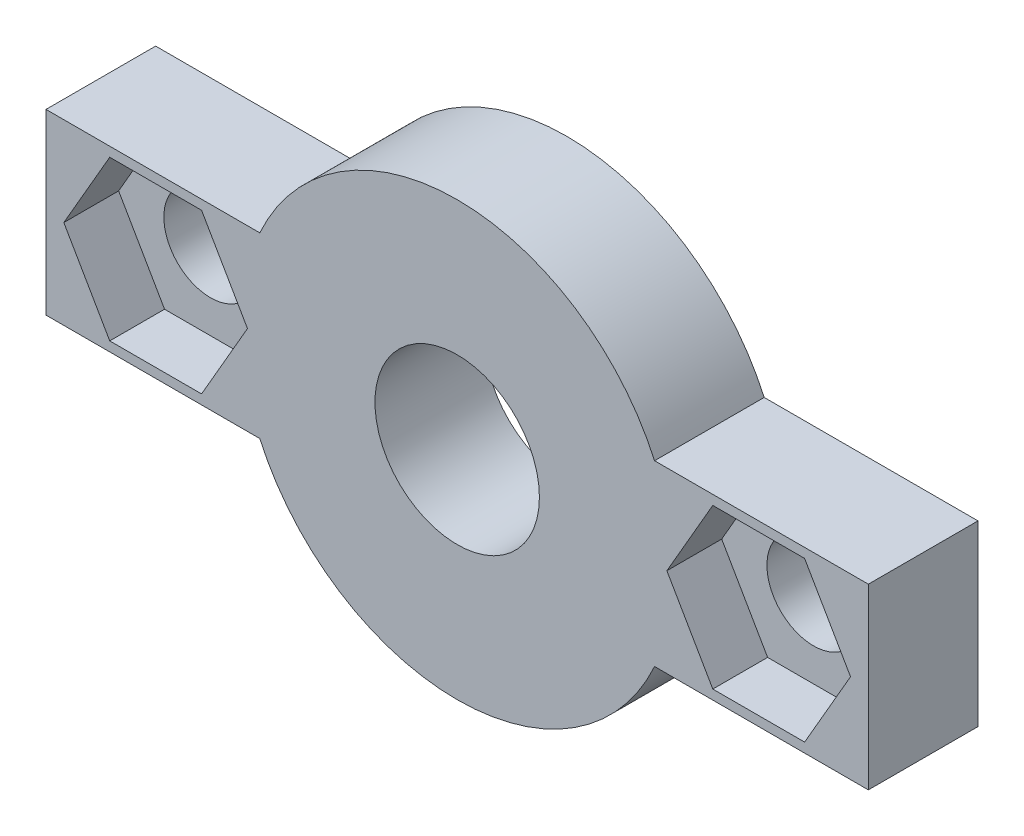
ISO-10303-21;
HEADER;
FILE_DESCRIPTION(('STEP AP214'),'2;1');
FILE_NAME('part.step','',(''),(''),'','','');
FILE_SCHEMA(('AUTOMOTIVE_DESIGN { 1 0 10303 214 1 1 1 1 }'));
ENDSEC;
DATA;
#1=APPLICATION_CONTEXT('core data for automotive mechanical design processes');
#2=APPLICATION_PROTOCOL_DEFINITION('international standard','automotive_design',2000,#1);
#3=PRODUCT_CONTEXT('',#1,'mechanical');
#4=PRODUCT('Part','Part','',(#3));
#5=PRODUCT_RELATED_PRODUCT_CATEGORY('part','',(#4));
#6=PRODUCT_DEFINITION_FORMATION('','',#4);
#7=PRODUCT_DEFINITION_CONTEXT('part definition',#1,'design');
#8=PRODUCT_DEFINITION('design','',#6,#7);
#9=PRODUCT_DEFINITION_SHAPE('','',#8);
#10=(LENGTH_UNIT() NAMED_UNIT(*) SI_UNIT(.MILLI.,.METRE.));
#11=(NAMED_UNIT(*) PLANE_ANGLE_UNIT() SI_UNIT($,.RADIAN.));
#12=(NAMED_UNIT(*) SI_UNIT($,.STERADIAN.) SOLID_ANGLE_UNIT());
#13=UNCERTAINTY_MEASURE_WITH_UNIT(LENGTH_MEASURE(1.E-05),#10,'distance_accuracy_value','');
#14=(GEOMETRIC_REPRESENTATION_CONTEXT(3) GLOBAL_UNCERTAINTY_ASSIGNED_CONTEXT((#13)) GLOBAL_UNIT_ASSIGNED_CONTEXT((#10,
#11,#12)) REPRESENTATION_CONTEXT('',''));
#15=CARTESIAN_POINT('',(0.,0.,0.));
#16=DIRECTION('',(0.,0.,1.));
#17=DIRECTION('',(1.,0.,0.));
#18=AXIS2_PLACEMENT_3D('',#15,#16,#17);
#19=CARTESIAN_POINT('',(0.,0.,4.));
#20=DIRECTION('',(0.,0.,1.));
#21=DIRECTION('',(1.,0.,0.));
#22=AXIS2_PLACEMENT_3D('',#19,#20,#21);
#23=PLANE('',#22);
#24=DIRECTION('',(-0.5,-0.866025403784439,0.));
#25=VECTOR('',#24,1.);
#26=CARTESIAN_POINT('',(-12.675,2.90118510267787,4.));
#27=LINE('',#26,#25);
#28=CARTESIAN_POINT('',(-12.675,2.90118510267787,4.));
#29=VERTEX_POINT('',#28);
#30=CARTESIAN_POINT('',(-14.35,0.,4.));
#31=VERTEX_POINT('',#30);
#32=EDGE_CURVE('E58',#29,#31,#27,.T.);
#33=ORIENTED_EDGE('',*,*,#32,.F.);
#34=DIRECTION('',(-1.,0.,0.));
#35=VECTOR('',#34,1.);
#36=CARTESIAN_POINT('',(-9.325,2.90118510267787,4.));
#37=LINE('',#36,#35);
#38=CARTESIAN_POINT('',(-9.325,2.90118510267787,4.));
#39=VERTEX_POINT('',#38);
#40=EDGE_CURVE('E204',#39,#29,#37,.T.);
#41=ORIENTED_EDGE('',*,*,#40,.F.);
#42=DIRECTION('',(-0.5,0.866025403784439,0.));
#43=VECTOR('',#42,1.);
#44=CARTESIAN_POINT('',(-7.65,0.,4.));
#45=LINE('',#44,#43);
#46=CARTESIAN_POINT('',(-7.65,0.,4.));
#47=VERTEX_POINT('',#46);
#48=EDGE_CURVE('E209',#47,#39,#45,.T.);
#49=ORIENTED_EDGE('',*,*,#48,.F.);
#50=DIRECTION('',(0.5,0.866025403784439,0.));
#51=VECTOR('',#50,1.);
#52=CARTESIAN_POINT('',(-9.325,-2.90118510267787,4.));
#53=LINE('',#52,#51);
#54=CARTESIAN_POINT('',(-9.325,-2.90118510267787,4.));
#55=VERTEX_POINT('',#54);
#56=EDGE_CURVE('E236',#55,#47,#53,.T.);
#57=ORIENTED_EDGE('',*,*,#56,.F.);
#58=DIRECTION('',(1.,0.,0.));
#59=VECTOR('',#58,1.);
#60=CARTESIAN_POINT('',(-12.675,-2.90118510267787,4.));
#61=LINE('',#60,#59);
#62=CARTESIAN_POINT('',(-12.675,-2.90118510267787,4.));
#63=VERTEX_POINT('',#62);
#64=EDGE_CURVE('E232',#63,#55,#61,.T.);
#65=ORIENTED_EDGE('',*,*,#64,.F.);
#66=DIRECTION('',(0.5,-0.866025403784438,0.));
#67=VECTOR('',#66,1.);
#68=CARTESIAN_POINT('',(-14.35,0.,4.));
#69=LINE('',#68,#67);
#70=EDGE_CURVE('E228',#31,#63,#69,.T.);
#71=ORIENTED_EDGE('',*,*,#70,.F.);
#72=EDGE_LOOP('',(#33,#41,#49,#57,#65,#71));
#73=FACE_BOUND('',#72,.T.);
#74=DIRECTION('',(0.5,0.866025403784439,0.));
#75=VECTOR('',#74,1.);
#76=CARTESIAN_POINT('',(12.675,-2.90118510267787,4.));
#77=LINE('',#76,#75);
#78=CARTESIAN_POINT('',(12.675,-2.90118510267787,4.));
#79=VERTEX_POINT('',#78);
#80=CARTESIAN_POINT('',(14.35,0.,4.));
#81=VERTEX_POINT('',#80);
#82=EDGE_CURVE('E66',#79,#81,#77,.T.);
#83=ORIENTED_EDGE('',*,*,#82,.F.);
#84=DIRECTION('',(1.,0.,0.));
#85=VECTOR('',#84,1.);
#86=CARTESIAN_POINT('',(9.325,-2.90118510267787,4.));
#87=LINE('',#86,#85);
#88=CARTESIAN_POINT('',(9.325,-2.90118510267787,4.));
#89=VERTEX_POINT('',#88);
#90=EDGE_CURVE('E263',#89,#79,#87,.T.);
#91=ORIENTED_EDGE('',*,*,#90,.F.);
#92=DIRECTION('',(0.5,-0.866025403784439,0.));
#93=VECTOR('',#92,1.);
#94=CARTESIAN_POINT('',(7.65,0.,4.));
#95=LINE('',#94,#93);
#96=CARTESIAN_POINT('',(7.65,0.,4.));
#97=VERTEX_POINT('',#96);
#98=EDGE_CURVE('E298',#97,#89,#95,.T.);
#99=ORIENTED_EDGE('',*,*,#98,.F.);
#100=DIRECTION('',(-0.5,-0.866025403784439,0.));
#101=VECTOR('',#100,1.);
#102=CARTESIAN_POINT('',(9.325,2.90118510267787,4.));
#103=LINE('',#102,#101);
#104=CARTESIAN_POINT('',(9.325,2.90118510267787,4.));
#105=VERTEX_POINT('',#104);
#106=EDGE_CURVE('E294',#105,#97,#103,.T.);
#107=ORIENTED_EDGE('',*,*,#106,.F.);
#108=DIRECTION('',(-1.,0.,0.));
#109=VECTOR('',#108,1.);
#110=CARTESIAN_POINT('',(12.675,2.90118510267787,4.));
#111=LINE('',#110,#109);
#112=CARTESIAN_POINT('',(12.675,2.90118510267787,4.));
#113=VERTEX_POINT('',#112);
#114=EDGE_CURVE('E290',#113,#105,#111,.T.);
#115=ORIENTED_EDGE('',*,*,#114,.F.);
#116=DIRECTION('',(-0.5,0.866025403784439,0.));
#117=VECTOR('',#116,1.);
#118=CARTESIAN_POINT('',(14.35,0.,4.));
#119=LINE('',#118,#117);
#120=EDGE_CURVE('E286',#81,#113,#119,.T.);
#121=ORIENTED_EDGE('',*,*,#120,.F.);
#122=EDGE_LOOP('',(#83,#91,#99,#107,#115,#121));
#123=FACE_BOUND('',#122,.T.);
#124=DIRECTION('',(0.,-1.,0.));
#125=VECTOR('',#124,1.);
#126=CARTESIAN_POINT('',(-15.,-3.25,4.));
#127=LINE('',#126,#125);
#128=CARTESIAN_POINT('',(-15.,3.25,4.));
#129=VERTEX_POINT('',#128);
#130=CARTESIAN_POINT('',(-15.,-3.25,4.));
#131=VERTEX_POINT('',#130);
#132=EDGE_CURVE('E329',#129,#131,#127,.T.);
#133=ORIENTED_EDGE('',*,*,#132,.T.);
#134=DIRECTION('',(1.,0.,0.));
#135=VECTOR('',#134,1.);
#136=CARTESIAN_POINT('',(-7.20052081449669,-3.25,4.));
#137=LINE('',#136,#135);
#138=CARTESIAN_POINT('',(-7.20052081449669,-3.25,4.));
#139=VERTEX_POINT('',#138);
#140=EDGE_CURVE('E333',#131,#139,#137,.T.);
#141=ORIENTED_EDGE('',*,*,#140,.T.);
#142=CARTESIAN_POINT('',(0.,0.,4.));
#143=DIRECTION('',(0.,0.,1.));
#144=DIRECTION('',(1.,0.,0.));
#145=AXIS2_PLACEMENT_3D('',#142,#143,#144);
#146=CIRCLE('',#145,7.9);
#147=CARTESIAN_POINT('',(7.20052081449669,-3.25,4.));
#148=VERTEX_POINT('',#147);
#149=EDGE_CURVE('E337',#139,#148,#146,.T.);
#150=ORIENTED_EDGE('',*,*,#149,.T.);
#151=DIRECTION('',(1.,0.,0.));
#152=VECTOR('',#151,1.);
#153=CARTESIAN_POINT('',(15.,-3.25,4.));
#154=LINE('',#153,#152);
#155=CARTESIAN_POINT('',(15.,-3.25,4.));
#156=VERTEX_POINT('',#155);
#157=EDGE_CURVE('E340',#148,#156,#154,.T.);
#158=ORIENTED_EDGE('',*,*,#157,.T.);
#159=DIRECTION('',(0.,1.,0.));
#160=VECTOR('',#159,1.);
#161=CARTESIAN_POINT('',(15.,-3.25,4.));
#162=LINE('',#161,#160);
#163=CARTESIAN_POINT('',(15.,3.25,4.));
#164=VERTEX_POINT('',#163);
#165=EDGE_CURVE('E343',#156,#164,#162,.T.);
#166=ORIENTED_EDGE('',*,*,#165,.T.);
#167=DIRECTION('',(-1.,0.,0.));
#168=VECTOR('',#167,1.);
#169=CARTESIAN_POINT('',(15.,3.25,4.));
#170=LINE('',#169,#168);
#171=CARTESIAN_POINT('',(7.20052081449669,3.25,4.));
#172=VERTEX_POINT('',#171);
#173=EDGE_CURVE('E346',#164,#172,#170,.T.);
#174=ORIENTED_EDGE('',*,*,#173,.T.);
#175=CARTESIAN_POINT('',(0.,0.,4.));
#176=DIRECTION('',(0.,0.,1.));
#177=DIRECTION('',(1.,0.,0.));
#178=AXIS2_PLACEMENT_3D('',#175,#176,#177);
#179=CIRCLE('',#178,7.9);
#180=CARTESIAN_POINT('',(-7.20052081449669,3.25,4.));
#181=VERTEX_POINT('',#180);
#182=EDGE_CURVE('E349',#172,#181,#179,.T.);
#183=ORIENTED_EDGE('',*,*,#182,.T.);
#184=DIRECTION('',(-1.,0.,0.));
#185=VECTOR('',#184,1.);
#186=CARTESIAN_POINT('',(-7.20052081449669,3.25,4.));
#187=LINE('',#186,#185);
#188=EDGE_CURVE('E352',#181,#129,#187,.T.);
#189=ORIENTED_EDGE('',*,*,#188,.T.);
#190=EDGE_LOOP('',(#133,#141,#150,#158,#166,#174,#183,#189));
#191=FACE_BOUND('',#190,.T.);
#192=CARTESIAN_POINT('',(0.,0.,4.));
#193=DIRECTION('',(0.,0.,1.));
#194=DIRECTION('',(1.,0.,0.));
#195=AXIS2_PLACEMENT_3D('',#192,#193,#194);
#196=CIRCLE('',#195,3.);
#197=CARTESIAN_POINT('',(3.,0.,4.));
#198=VERTEX_POINT('',#197);
#199=EDGE_CURVE('E321',#198,#198,#196,.T.);
#200=ORIENTED_EDGE('',*,*,#199,.F.);
#201=EDGE_LOOP('',(#200));
#202=FACE_BOUND('',#201,.T.);
#203=ADVANCED_FACE('F40',(#73,#123,#191,#202),#23,.T.);
#204=CARTESIAN_POINT('',(0.,0.,0.));
#205=DIRECTION('',(0.,0.,1.));
#206=DIRECTION('',(1.,0.,0.));
#207=AXIS2_PLACEMENT_3D('',#204,#205,#206);
#208=PLANE('',#207);
#209=CARTESIAN_POINT('',(-11.,0.,0.));
#210=DIRECTION('',(0.,0.,1.));
#211=DIRECTION('',(1.,0.,0.));
#212=AXIS2_PLACEMENT_3D('',#209,#210,#211);
#213=CIRCLE('',#212,1.7);
#214=CARTESIAN_POINT('',(-9.3,0.,0.));
#215=VERTEX_POINT('',#214);
#216=EDGE_CURVE('E407',#215,#215,#213,.T.);
#217=ORIENTED_EDGE('',*,*,#216,.T.);
#218=EDGE_LOOP('',(#217));
#219=FACE_BOUND('',#218,.T.);
#220=CARTESIAN_POINT('',(11.,0.,0.));
#221=DIRECTION('',(0.,0.,1.));
#222=DIRECTION('',(1.,0.,0.));
#223=AXIS2_PLACEMENT_3D('',#220,#221,#222);
#224=CIRCLE('',#223,1.7);
#225=CARTESIAN_POINT('',(12.7,0.,0.));
#226=VERTEX_POINT('',#225);
#227=EDGE_CURVE('E212',#226,#226,#224,.T.);
#228=ORIENTED_EDGE('',*,*,#227,.T.);
#229=EDGE_LOOP('',(#228));
#230=FACE_BOUND('',#229,.T.);
#231=DIRECTION('',(0.,-1.,0.));
#232=VECTOR('',#231,1.);
#233=CARTESIAN_POINT('',(-15.,-3.25,0.));
#234=LINE('',#233,#232);
#235=CARTESIAN_POINT('',(-15.,3.25,0.));
#236=VERTEX_POINT('',#235);
#237=CARTESIAN_POINT('',(-15.,-3.25,0.));
#238=VERTEX_POINT('',#237);
#239=EDGE_CURVE('E325',#236,#238,#234,.T.);
#240=ORIENTED_EDGE('',*,*,#239,.F.);
#241=DIRECTION('',(-1.,0.,0.));
#242=VECTOR('',#241,1.);
#243=CARTESIAN_POINT('',(-7.20052081449669,3.25,0.));
#244=LINE('',#243,#242);
#245=CARTESIAN_POINT('',(-7.20052081449669,3.25,0.));
#246=VERTEX_POINT('',#245);
#247=EDGE_CURVE('E334',#246,#236,#244,.T.);
#248=ORIENTED_EDGE('',*,*,#247,.F.);
#249=CARTESIAN_POINT('',(0.,0.,0.));
#250=DIRECTION('',(0.,0.,1.));
#251=DIRECTION('',(1.,0.,0.));
#252=AXIS2_PLACEMENT_3D('',#249,#250,#251);
#253=CIRCLE('',#252,7.9);
#254=CARTESIAN_POINT('',(7.20052081449669,3.25,0.));
#255=VERTEX_POINT('',#254);
#256=EDGE_CURVE('E374',#255,#246,#253,.T.);
#257=ORIENTED_EDGE('',*,*,#256,.F.);
#258=DIRECTION('',(-1.,0.,0.));
#259=VECTOR('',#258,1.);
#260=CARTESIAN_POINT('',(15.,3.25,0.));
#261=LINE('',#260,#259);
#262=CARTESIAN_POINT('',(15.,3.25,0.));
#263=VERTEX_POINT('',#262);
#264=EDGE_CURVE('E371',#263,#255,#261,.T.);
#265=ORIENTED_EDGE('',*,*,#264,.F.);
#266=DIRECTION('',(0.,1.,0.));
#267=VECTOR('',#266,1.);
#268=CARTESIAN_POINT('',(15.,-3.25,0.));
#269=LINE('',#268,#267);
#270=CARTESIAN_POINT('',(15.,-3.25,0.));
#271=VERTEX_POINT('',#270);
#272=EDGE_CURVE('E368',#271,#263,#269,.T.);
#273=ORIENTED_EDGE('',*,*,#272,.F.);
#274=DIRECTION('',(1.,0.,0.));
#275=VECTOR('',#274,1.);
#276=CARTESIAN_POINT('',(15.,-3.25,0.));
#277=LINE('',#276,#275);
#278=CARTESIAN_POINT('',(7.20052081449669,-3.25,0.));
#279=VERTEX_POINT('',#278);
#280=EDGE_CURVE('E365',#279,#271,#277,.T.);
#281=ORIENTED_EDGE('',*,*,#280,.F.);
#282=CARTESIAN_POINT('',(0.,0.,0.));
#283=DIRECTION('',(0.,0.,1.));
#284=DIRECTION('',(1.,0.,0.));
#285=AXIS2_PLACEMENT_3D('',#282,#283,#284);
#286=CIRCLE('',#285,7.9);
#287=CARTESIAN_POINT('',(-7.20052081449669,-3.25,0.));
#288=VERTEX_POINT('',#287);
#289=EDGE_CURVE('E362',#288,#279,#286,.T.);
#290=ORIENTED_EDGE('',*,*,#289,.F.);
#291=DIRECTION('',(1.,0.,0.));
#292=VECTOR('',#291,1.);
#293=CARTESIAN_POINT('',(-7.20052081449669,-3.25,0.));
#294=LINE('',#293,#292);
#295=EDGE_CURVE('E359',#238,#288,#294,.T.);
#296=ORIENTED_EDGE('',*,*,#295,.F.);
#297=EDGE_LOOP('',(#240,#248,#257,#265,#273,#281,#290,#296));
#298=FACE_BOUND('',#297,.T.);
#299=CARTESIAN_POINT('',(0.,0.,0.));
#300=DIRECTION('',(0.,0.,1.));
#301=DIRECTION('',(1.,0.,0.));
#302=AXIS2_PLACEMENT_3D('',#299,#300,#301);
#303=CIRCLE('',#302,3.);
#304=CARTESIAN_POINT('',(3.,0.,0.));
#305=VERTEX_POINT('',#304);
#306=EDGE_CURVE('E246',#305,#305,#303,.T.);
#307=ORIENTED_EDGE('',*,*,#306,.T.);
#308=EDGE_LOOP('',(#307));
#309=FACE_BOUND('',#308,.T.);
#310=ADVANCED_FACE('F426',(#219,#230,#298,#309),#208,.F.);
#311=CARTESIAN_POINT('',(-15.,-3.25,4.));
#312=DIRECTION('',(1.,0.,0.));
#313=DIRECTION('',(0.,0.,-1.));
#314=AXIS2_PLACEMENT_3D('',#311,#312,#313);
#315=PLANE('',#314);
#316=ORIENTED_EDGE('',*,*,#239,.T.);
#317=DIRECTION('',(0.,0.,-1.));
#318=VECTOR('',#317,1.);
#319=CARTESIAN_POINT('',(-15.,-3.25,4.));
#320=LINE('',#319,#318);
#321=EDGE_CURVE('E11',#131,#238,#320,.T.);
#322=ORIENTED_EDGE('',*,*,#321,.F.);
#323=ORIENTED_EDGE('',*,*,#132,.F.);
#324=DIRECTION('',(0.,0.,-1.));
#325=VECTOR('',#324,1.);
#326=CARTESIAN_POINT('',(-15.,3.25,4.));
#327=LINE('',#326,#325);
#328=EDGE_CURVE('E355',#129,#236,#327,.T.);
#329=ORIENTED_EDGE('',*,*,#328,.T.);
#330=EDGE_LOOP('',(#316,#322,#323,#329));
#331=FACE_BOUND('',#330,.T.);
#332=ADVANCED_FACE('F42',(#331),#315,.F.);
#333=CARTESIAN_POINT('',(-7.20052081449669,-3.25,4.));
#334=DIRECTION('',(0.,1.,0.));
#335=DIRECTION('',(-1.,0.,0.));
#336=AXIS2_PLACEMENT_3D('',#333,#334,#335);
#337=PLANE('',#336);
#338=ORIENTED_EDGE('',*,*,#295,.T.);
#339=DIRECTION('',(0.,0.,-1.));
#340=VECTOR('',#339,1.);
#341=CARTESIAN_POINT('',(-7.20052081449669,-3.25,4.));
#342=LINE('',#341,#340);
#343=EDGE_CURVE('E50',#139,#288,#342,.T.);
#344=ORIENTED_EDGE('',*,*,#343,.F.);
#345=ORIENTED_EDGE('',*,*,#140,.F.);
#346=ORIENTED_EDGE('',*,*,#321,.T.);
#347=EDGE_LOOP('',(#338,#344,#345,#346));
#348=FACE_BOUND('',#347,.T.);
#349=ADVANCED_FACE('F472',(#348),#337,.F.);
#350=CARTESIAN_POINT('',(0.,0.,4.));
#351=DIRECTION('',(0.,0.,-1.));
#352=DIRECTION('',(-1.,0.,0.));
#353=AXIS2_PLACEMENT_3D('',#350,#351,#352);
#354=CYLINDRICAL_SURFACE('',#353,7.9);
#355=ORIENTED_EDGE('',*,*,#289,.T.);
#356=DIRECTION('',(0.,0.,-1.));
#357=VECTOR('',#356,1.);
#358=CARTESIAN_POINT('',(7.20052081449669,-3.25,4.));
#359=LINE('',#358,#357);
#360=EDGE_CURVE('E398',#148,#279,#359,.T.);
#361=ORIENTED_EDGE('',*,*,#360,.F.);
#362=ORIENTED_EDGE('',*,*,#149,.F.);
#363=ORIENTED_EDGE('',*,*,#343,.T.);
#364=EDGE_LOOP('',(#355,#361,#362,#363));
#365=FACE_BOUND('',#364,.T.);
#366=ADVANCED_FACE('F469',(#365),#354,.T.);
#367=CARTESIAN_POINT('',(15.,-3.25,4.));
#368=DIRECTION('',(0.,1.,0.));
#369=DIRECTION('',(-1.,0.,0.));
#370=AXIS2_PLACEMENT_3D('',#367,#368,#369);
#371=PLANE('',#370);
#372=ORIENTED_EDGE('',*,*,#280,.T.);
#373=DIRECTION('',(0.,0.,-1.));
#374=VECTOR('',#373,1.);
#375=CARTESIAN_POINT('',(15.,-3.25,4.));
#376=LINE('',#375,#374);
#377=EDGE_CURVE('E394',#156,#271,#376,.T.);
#378=ORIENTED_EDGE('',*,*,#377,.F.);
#379=ORIENTED_EDGE('',*,*,#157,.F.);
#380=ORIENTED_EDGE('',*,*,#360,.T.);
#381=EDGE_LOOP('',(#372,#378,#379,#380));
#382=FACE_BOUND('',#381,.T.);
#383=ADVANCED_FACE('F465',(#382),#371,.F.);
#384=CARTESIAN_POINT('',(15.,-3.25,4.));
#385=DIRECTION('',(-1.,0.,0.));
#386=DIRECTION('',(0.,-1.,0.));
#387=AXIS2_PLACEMENT_3D('',#384,#385,#386);
#388=PLANE('',#387);
#389=ORIENTED_EDGE('',*,*,#272,.T.);
#390=DIRECTION('',(0.,0.,-1.));
#391=VECTOR('',#390,1.);
#392=CARTESIAN_POINT('',(15.,3.25,4.));
#393=LINE('',#392,#391);
#394=EDGE_CURVE('E390',#164,#263,#393,.T.);
#395=ORIENTED_EDGE('',*,*,#394,.F.);
#396=ORIENTED_EDGE('',*,*,#165,.F.);
#397=ORIENTED_EDGE('',*,*,#377,.T.);
#398=EDGE_LOOP('',(#389,#395,#396,#397));
#399=FACE_BOUND('',#398,.T.);
#400=ADVANCED_FACE('F461',(#399),#388,.F.);
#401=CARTESIAN_POINT('',(15.,3.25,4.));
#402=DIRECTION('',(0.,-1.,0.));
#403=DIRECTION('',(1.,0.,0.));
#404=AXIS2_PLACEMENT_3D('',#401,#402,#403);
#405=PLANE('',#404);
#406=ORIENTED_EDGE('',*,*,#264,.T.);
#407=DIRECTION('',(0.,0.,-1.));
#408=VECTOR('',#407,1.);
#409=CARTESIAN_POINT('',(7.20052081449669,3.25,4.));
#410=LINE('',#409,#408);
#411=EDGE_CURVE('E386',#172,#255,#410,.T.);
#412=ORIENTED_EDGE('',*,*,#411,.F.);
#413=ORIENTED_EDGE('',*,*,#173,.F.);
#414=ORIENTED_EDGE('',*,*,#394,.T.);
#415=EDGE_LOOP('',(#406,#412,#413,#414));
#416=FACE_BOUND('',#415,.T.);
#417=ADVANCED_FACE('F457',(#416),#405,.F.);
#418=CARTESIAN_POINT('',(0.,0.,4.));
#419=DIRECTION('',(0.,0.,-1.));
#420=DIRECTION('',(-1.,0.,0.));
#421=AXIS2_PLACEMENT_3D('',#418,#419,#420);
#422=CYLINDRICAL_SURFACE('',#421,7.9);
#423=ORIENTED_EDGE('',*,*,#256,.T.);
#424=DIRECTION('',(0.,0.,-1.));
#425=VECTOR('',#424,1.);
#426=CARTESIAN_POINT('',(-7.20052081449669,3.25,4.));
#427=LINE('',#426,#425);
#428=EDGE_CURVE('E382',#181,#246,#427,.T.);
#429=ORIENTED_EDGE('',*,*,#428,.F.);
#430=ORIENTED_EDGE('',*,*,#182,.F.);
#431=ORIENTED_EDGE('',*,*,#411,.T.);
#432=EDGE_LOOP('',(#423,#429,#430,#431));
#433=FACE_BOUND('',#432,.T.);
#434=ADVANCED_FACE('F453',(#433),#422,.T.);
#435=CARTESIAN_POINT('',(-7.20052081449669,3.25,4.));
#436=DIRECTION('',(0.,-1.,0.));
#437=DIRECTION('',(1.,0.,0.));
#438=AXIS2_PLACEMENT_3D('',#435,#436,#437);
#439=PLANE('',#438);
#440=ORIENTED_EDGE('',*,*,#247,.T.);
#441=ORIENTED_EDGE('',*,*,#328,.F.);
#442=ORIENTED_EDGE('',*,*,#188,.F.);
#443=ORIENTED_EDGE('',*,*,#428,.T.);
#444=EDGE_LOOP('',(#440,#441,#442,#443));
#445=FACE_BOUND('',#444,.T.);
#446=ADVANCED_FACE('F450',(#445),#439,.F.);
#447=CARTESIAN_POINT('',(0.,0.,4.));
#448=DIRECTION('',(0.,0.,-1.));
#449=DIRECTION('',(-1.,0.,0.));
#450=AXIS2_PLACEMENT_3D('',#447,#448,#449);
#451=CYLINDRICAL_SURFACE('',#450,3.);
#452=ORIENTED_EDGE('',*,*,#199,.T.);
#453=EDGE_LOOP('',(#452));
#454=FACE_BOUND('',#453,.T.);
#455=ORIENTED_EDGE('',*,*,#306,.F.);
#456=EDGE_LOOP('',(#455));
#457=FACE_BOUND('',#456,.T.);
#458=ADVANCED_FACE('F447',(#454,#457),#451,.F.);
#459=CARTESIAN_POINT('',(12.675,-2.90118510267787,2.));
#460=DIRECTION('',(0.866025403784439,-0.5,0.));
#461=DIRECTION('',(0.5,0.866025403784439,0.));
#462=AXIS2_PLACEMENT_3D('',#459,#460,#461);
#463=PLANE('',#462);
#464=ORIENTED_EDGE('',*,*,#82,.T.);
#465=DIRECTION('',(0.,0.,1.));
#466=VECTOR('',#465,1.);
#467=CARTESIAN_POINT('',(14.35,0.,2.));
#468=LINE('',#467,#466);
#469=CARTESIAN_POINT('',(14.35,0.,2.));
#470=VERTEX_POINT('',#469);
#471=EDGE_CURVE('E283',#470,#81,#468,.T.);
#472=ORIENTED_EDGE('',*,*,#471,.F.);
#473=DIRECTION('',(0.5,0.866025403784439,0.));
#474=VECTOR('',#473,1.);
#475=CARTESIAN_POINT('',(12.675,-2.90118510267787,2.));
#476=LINE('',#475,#474);
#477=CARTESIAN_POINT('',(12.675,-2.90118510267787,2.));
#478=VERTEX_POINT('',#477);
#479=EDGE_CURVE('E258',#478,#470,#476,.T.);
#480=ORIENTED_EDGE('',*,*,#479,.F.);
#481=DIRECTION('',(0.,0.,1.));
#482=VECTOR('',#481,1.);
#483=CARTESIAN_POINT('',(12.675,-2.90118510267787,2.));
#484=LINE('',#483,#482);
#485=EDGE_CURVE('E229',#478,#79,#484,.T.);
#486=ORIENTED_EDGE('',*,*,#485,.T.);
#487=EDGE_LOOP('',(#464,#472,#480,#486));
#488=FACE_BOUND('',#487,.T.);
#489=ADVANCED_FACE('F509',(#488),#463,.F.);
#490=CARTESIAN_POINT('',(9.325,-2.90118510267787,2.));
#491=DIRECTION('',(0.,-1.,0.));
#492=DIRECTION('',(0.,0.,-1.));
#493=AXIS2_PLACEMENT_3D('',#490,#491,#492);
#494=PLANE('',#493);
#495=ORIENTED_EDGE('',*,*,#90,.T.);
#496=ORIENTED_EDGE('',*,*,#485,.F.);
#497=DIRECTION('',(1.,0.,0.));
#498=VECTOR('',#497,1.);
#499=CARTESIAN_POINT('',(9.325,-2.90118510267787,2.));
#500=LINE('',#499,#498);
#501=CARTESIAN_POINT('',(9.325,-2.90118510267787,2.));
#502=VERTEX_POINT('',#501);
#503=EDGE_CURVE('E279',#502,#478,#500,.T.);
#504=ORIENTED_EDGE('',*,*,#503,.F.);
#505=DIRECTION('',(0.,0.,1.));
#506=VECTOR('',#505,1.);
#507=CARTESIAN_POINT('',(9.325,-2.90118510267787,2.));
#508=LINE('',#507,#506);
#509=EDGE_CURVE('E307',#502,#89,#508,.T.);
#510=ORIENTED_EDGE('',*,*,#509,.T.);
#511=EDGE_LOOP('',(#495,#496,#504,#510));
#512=FACE_BOUND('',#511,.T.);
#513=ADVANCED_FACE('F514',(#512),#494,.F.);
#514=CARTESIAN_POINT('',(7.65,0.,2.));
#515=DIRECTION('',(-0.866025403784439,-0.499999999999999,0.));
#516=DIRECTION('',(0.499999999999999,-0.866025403784439,0.));
#517=AXIS2_PLACEMENT_3D('',#514,#515,#516);
#518=PLANE('',#517);
#519=ORIENTED_EDGE('',*,*,#98,.T.);
#520=ORIENTED_EDGE('',*,*,#509,.F.);
#521=DIRECTION('',(0.5,-0.866025403784439,0.));
#522=VECTOR('',#521,1.);
#523=CARTESIAN_POINT('',(7.65,0.,2.));
#524=LINE('',#523,#522);
#525=CARTESIAN_POINT('',(7.65,0.,2.));
#526=VERTEX_POINT('',#525);
#527=EDGE_CURVE('E275',#526,#502,#524,.T.);
#528=ORIENTED_EDGE('',*,*,#527,.F.);
#529=DIRECTION('',(0.,0.,1.));
#530=VECTOR('',#529,1.);
#531=CARTESIAN_POINT('',(7.65,0.,2.));
#532=LINE('',#531,#530);
#533=EDGE_CURVE('E310',#526,#97,#532,.T.);
#534=ORIENTED_EDGE('',*,*,#533,.T.);
#535=EDGE_LOOP('',(#519,#520,#528,#534));
#536=FACE_BOUND('',#535,.T.);
#537=ADVANCED_FACE('F518',(#536),#518,.F.);
#538=CARTESIAN_POINT('',(9.325,2.90118510267787,2.));
#539=DIRECTION('',(-0.866025403784439,0.5,0.));
#540=DIRECTION('',(-0.5,-0.866025403784439,0.));
#541=AXIS2_PLACEMENT_3D('',#538,#539,#540);
#542=PLANE('',#541);
#543=ORIENTED_EDGE('',*,*,#106,.T.);
#544=ORIENTED_EDGE('',*,*,#533,.F.);
#545=DIRECTION('',(-0.5,-0.866025403784439,0.));
#546=VECTOR('',#545,1.);
#547=CARTESIAN_POINT('',(9.325,2.90118510267787,2.));
#548=LINE('',#547,#546);
#549=CARTESIAN_POINT('',(9.325,2.90118510267787,2.));
#550=VERTEX_POINT('',#549);
#551=EDGE_CURVE('E271',#550,#526,#548,.T.);
#552=ORIENTED_EDGE('',*,*,#551,.F.);
#553=DIRECTION('',(0.,0.,1.));
#554=VECTOR('',#553,1.);
#555=CARTESIAN_POINT('',(9.325,2.90118510267787,2.));
#556=LINE('',#555,#554);
#557=EDGE_CURVE('E313',#550,#105,#556,.T.);
#558=ORIENTED_EDGE('',*,*,#557,.T.);
#559=EDGE_LOOP('',(#543,#544,#552,#558));
#560=FACE_BOUND('',#559,.T.);
#561=ADVANCED_FACE('F530',(#560),#542,.F.);
#562=CARTESIAN_POINT('',(12.675,2.90118510267787,2.));
#563=DIRECTION('',(0.,1.,0.));
#564=DIRECTION('',(-1.,0.,0.));
#565=AXIS2_PLACEMENT_3D('',#562,#563,#564);
#566=PLANE('',#565);
#567=ORIENTED_EDGE('',*,*,#114,.T.);
#568=ORIENTED_EDGE('',*,*,#557,.F.);
#569=DIRECTION('',(-1.,0.,0.));
#570=VECTOR('',#569,1.);
#571=CARTESIAN_POINT('',(12.675,2.90118510267787,2.));
#572=LINE('',#571,#570);
#573=CARTESIAN_POINT('',(12.675,2.90118510267787,2.));
#574=VERTEX_POINT('',#573);
#575=EDGE_CURVE('E267',#574,#550,#572,.T.);
#576=ORIENTED_EDGE('',*,*,#575,.F.);
#577=DIRECTION('',(0.,0.,1.));
#578=VECTOR('',#577,1.);
#579=CARTESIAN_POINT('',(12.675,2.90118510267787,2.));
#580=LINE('',#579,#578);
#581=EDGE_CURVE('E316',#574,#113,#580,.T.);
#582=ORIENTED_EDGE('',*,*,#581,.T.);
#583=EDGE_LOOP('',(#567,#568,#576,#582));
#584=FACE_BOUND('',#583,.T.);
#585=ADVANCED_FACE('F526',(#584),#566,.F.);
#586=CARTESIAN_POINT('',(14.35,0.,2.));
#587=DIRECTION('',(0.866025403784439,0.5,0.));
#588=DIRECTION('',(-0.5,0.866025403784439,0.));
#589=AXIS2_PLACEMENT_3D('',#586,#587,#588);
#590=PLANE('',#589);
#591=ORIENTED_EDGE('',*,*,#120,.T.);
#592=ORIENTED_EDGE('',*,*,#581,.F.);
#593=DIRECTION('',(-0.5,0.866025403784439,0.));
#594=VECTOR('',#593,1.);
#595=CARTESIAN_POINT('',(14.35,0.,2.));
#596=LINE('',#595,#594);
#597=EDGE_CURVE('E262',#470,#574,#596,.T.);
#598=ORIENTED_EDGE('',*,*,#597,.F.);
#599=ORIENTED_EDGE('',*,*,#471,.T.);
#600=EDGE_LOOP('',(#591,#592,#598,#599));
#601=FACE_BOUND('',#600,.T.);
#602=ADVANCED_FACE('F522',(#601),#590,.F.);
#603=CARTESIAN_POINT('',(0.,0.,2.));
#604=DIRECTION('',(0.,0.,1.));
#605=DIRECTION('',(1.,0.,0.));
#606=AXIS2_PLACEMENT_3D('',#603,#604,#605);
#607=PLANE('',#606);
#608=CARTESIAN_POINT('',(11.,0.,2.));
#609=DIRECTION('',(0.,0.,1.));
#610=DIRECTION('',(1.,0.,0.));
#611=AXIS2_PLACEMENT_3D('',#608,#609,#610);
#612=CIRCLE('',#611,1.7);
#613=CARTESIAN_POINT('',(12.7,0.,2.));
#614=VERTEX_POINT('',#613);
#615=EDGE_CURVE('E44',#614,#614,#612,.T.);
#616=ORIENTED_EDGE('',*,*,#615,.F.);
#617=EDGE_LOOP('',(#616));
#618=FACE_BOUND('',#617,.T.);
#619=ORIENTED_EDGE('',*,*,#479,.T.);
#620=ORIENTED_EDGE('',*,*,#597,.T.);
#621=ORIENTED_EDGE('',*,*,#575,.T.);
#622=ORIENTED_EDGE('',*,*,#551,.T.);
#623=ORIENTED_EDGE('',*,*,#527,.T.);
#624=ORIENTED_EDGE('',*,*,#503,.T.);
#625=EDGE_LOOP('',(#619,#620,#621,#622,#623,#624));
#626=FACE_BOUND('',#625,.T.);
#627=ADVANCED_FACE('F525',(#618,#626),#607,.T.);
#628=CARTESIAN_POINT('',(-12.675,2.90118510267787,2.));
#629=DIRECTION('',(-0.866025403784439,0.5,0.));
#630=DIRECTION('',(-0.5,-0.866025403784439,0.));
#631=AXIS2_PLACEMENT_3D('',#628,#629,#630);
#632=PLANE('',#631);
#633=ORIENTED_EDGE('',*,*,#32,.T.);
#634=DIRECTION('',(0.,0.,1.));
#635=VECTOR('',#634,1.);
#636=CARTESIAN_POINT('',(-14.35,0.,2.));
#637=LINE('',#636,#635);
#638=CARTESIAN_POINT('',(-14.35,0.,2.));
#639=VERTEX_POINT('',#638);
#640=EDGE_CURVE('E178',#639,#31,#637,.T.);
#641=ORIENTED_EDGE('',*,*,#640,.F.);
#642=DIRECTION('',(-0.5,-0.866025403784439,0.));
#643=VECTOR('',#642,1.);
#644=CARTESIAN_POINT('',(-12.675,2.90118510267787,2.));
#645=LINE('',#644,#643);
#646=CARTESIAN_POINT('',(-12.675,2.90118510267787,2.));
#647=VERTEX_POINT('',#646);
#648=EDGE_CURVE('E182',#647,#639,#645,.T.);
#649=ORIENTED_EDGE('',*,*,#648,.F.);
#650=DIRECTION('',(0.,0.,1.));
#651=VECTOR('',#650,1.);
#652=CARTESIAN_POINT('',(-12.675,2.90118510267787,2.));
#653=LINE('',#652,#651);
#654=EDGE_CURVE('E243',#647,#29,#653,.T.);
#655=ORIENTED_EDGE('',*,*,#654,.T.);
#656=EDGE_LOOP('',(#633,#641,#649,#655));
#657=FACE_BOUND('',#656,.T.);
#658=ADVANCED_FACE('F180',(#657),#632,.F.);
#659=CARTESIAN_POINT('',(-9.325,2.90118510267787,2.));
#660=DIRECTION('',(0.,1.,0.));
#661=DIRECTION('',(0.,0.,1.));
#662=AXIS2_PLACEMENT_3D('',#659,#660,#661);
#663=PLANE('',#662);
#664=ORIENTED_EDGE('',*,*,#40,.T.);
#665=ORIENTED_EDGE('',*,*,#654,.F.);
#666=DIRECTION('',(-1.,0.,0.));
#667=VECTOR('',#666,1.);
#668=CARTESIAN_POINT('',(-9.325,2.90118510267787,2.));
#669=LINE('',#668,#667);
#670=CARTESIAN_POINT('',(-9.325,2.90118510267787,2.));
#671=VERTEX_POINT('',#670);
#672=EDGE_CURVE('E189',#671,#647,#669,.T.);
#673=ORIENTED_EDGE('',*,*,#672,.F.);
#674=DIRECTION('',(0.,0.,1.));
#675=VECTOR('',#674,1.);
#676=CARTESIAN_POINT('',(-9.325,2.90118510267787,2.));
#677=LINE('',#676,#675);
#678=EDGE_CURVE('E247',#671,#39,#677,.T.);
#679=ORIENTED_EDGE('',*,*,#678,.T.);
#680=EDGE_LOOP('',(#664,#665,#673,#679));
#681=FACE_BOUND('',#680,.T.);
#682=ADVANCED_FACE('F543',(#681),#663,.F.);
#683=CARTESIAN_POINT('',(-7.65,0.,2.));
#684=DIRECTION('',(0.866025403784439,0.5,0.));
#685=DIRECTION('',(-0.5,0.866025403784439,0.));
#686=AXIS2_PLACEMENT_3D('',#683,#684,#685);
#687=PLANE('',#686);
#688=ORIENTED_EDGE('',*,*,#48,.T.);
#689=ORIENTED_EDGE('',*,*,#678,.F.);
#690=DIRECTION('',(-0.5,0.866025403784439,0.));
#691=VECTOR('',#690,1.);
#692=CARTESIAN_POINT('',(-7.65,0.,2.));
#693=LINE('',#692,#691);
#694=CARTESIAN_POINT('',(-7.65,0.,2.));
#695=VERTEX_POINT('',#694);
#696=EDGE_CURVE('E221',#695,#671,#693,.T.);
#697=ORIENTED_EDGE('',*,*,#696,.F.);
#698=DIRECTION('',(0.,0.,1.));
#699=VECTOR('',#698,1.);
#700=CARTESIAN_POINT('',(-7.65,0.,2.));
#701=LINE('',#700,#699);
#702=EDGE_CURVE('E250',#695,#47,#701,.T.);
#703=ORIENTED_EDGE('',*,*,#702,.T.);
#704=EDGE_LOOP('',(#688,#689,#697,#703));
#705=FACE_BOUND('',#704,.T.);
#706=ADVANCED_FACE('F553',(#705),#687,.F.);
#707=CARTESIAN_POINT('',(-9.325,-2.90118510267787,2.));
#708=DIRECTION('',(0.866025403784439,-0.5,0.));
#709=DIRECTION('',(0.5,0.866025403784439,0.));
#710=AXIS2_PLACEMENT_3D('',#707,#708,#709);
#711=PLANE('',#710);
#712=ORIENTED_EDGE('',*,*,#56,.T.);
#713=ORIENTED_EDGE('',*,*,#702,.F.);
#714=DIRECTION('',(0.5,0.866025403784439,0.));
#715=VECTOR('',#714,1.);
#716=CARTESIAN_POINT('',(-9.325,-2.90118510267787,2.));
#717=LINE('',#716,#715);
#718=CARTESIAN_POINT('',(-9.325,-2.90118510267787,2.));
#719=VERTEX_POINT('',#718);
#720=EDGE_CURVE('E217',#719,#695,#717,.T.);
#721=ORIENTED_EDGE('',*,*,#720,.F.);
#722=DIRECTION('',(0.,0.,1.));
#723=VECTOR('',#722,1.);
#724=CARTESIAN_POINT('',(-9.325,-2.90118510267787,2.));
#725=LINE('',#724,#723);
#726=EDGE_CURVE('E253',#719,#55,#725,.T.);
#727=ORIENTED_EDGE('',*,*,#726,.T.);
#728=EDGE_LOOP('',(#712,#713,#721,#727));
#729=FACE_BOUND('',#728,.T.);
#730=ADVANCED_FACE('F549',(#729),#711,.F.);
#731=CARTESIAN_POINT('',(-12.675,-2.90118510267787,2.));
#732=DIRECTION('',(0.,-1.,0.));
#733=DIRECTION('',(0.,0.,-1.));
#734=AXIS2_PLACEMENT_3D('',#731,#732,#733);
#735=PLANE('',#734);
#736=ORIENTED_EDGE('',*,*,#64,.T.);
#737=ORIENTED_EDGE('',*,*,#726,.F.);
#738=DIRECTION('',(1.,0.,0.));
#739=VECTOR('',#738,1.);
#740=CARTESIAN_POINT('',(-12.675,-2.90118510267787,2.));
#741=LINE('',#740,#739);
#742=CARTESIAN_POINT('',(-12.675,-2.90118510267787,2.));
#743=VERTEX_POINT('',#742);
#744=EDGE_CURVE('E198',#743,#719,#741,.T.);
#745=ORIENTED_EDGE('',*,*,#744,.F.);
#746=DIRECTION('',(0.,0.,1.));
#747=VECTOR('',#746,1.);
#748=CARTESIAN_POINT('',(-12.675,-2.90118510267787,2.));
#749=LINE('',#748,#747);
#750=EDGE_CURVE('E188',#743,#63,#749,.T.);
#751=ORIENTED_EDGE('',*,*,#750,.T.);
#752=EDGE_LOOP('',(#736,#737,#745,#751));
#753=FACE_BOUND('',#752,.T.);
#754=ADVANCED_FACE('F546',(#753),#735,.F.);
#755=CARTESIAN_POINT('',(-14.35,0.,2.));
#756=DIRECTION('',(-0.866025403784438,-0.5,0.));
#757=DIRECTION('',(0.5,-0.866025403784438,0.));
#758=AXIS2_PLACEMENT_3D('',#755,#756,#757);
#759=PLANE('',#758);
#760=ORIENTED_EDGE('',*,*,#70,.T.);
#761=ORIENTED_EDGE('',*,*,#750,.F.);
#762=DIRECTION('',(0.5,-0.866025403784438,0.));
#763=VECTOR('',#762,1.);
#764=CARTESIAN_POINT('',(-14.35,0.,2.));
#765=LINE('',#764,#763);
#766=EDGE_CURVE('E192',#639,#743,#765,.T.);
#767=ORIENTED_EDGE('',*,*,#766,.F.);
#768=ORIENTED_EDGE('',*,*,#640,.T.);
#769=EDGE_LOOP('',(#760,#761,#767,#768));
#770=FACE_BOUND('',#769,.T.);
#771=ADVANCED_FACE('F193',(#770),#759,.F.);
#772=CARTESIAN_POINT('',(0.,0.,2.));
#773=DIRECTION('',(0.,0.,1.));
#774=DIRECTION('',(1.,0.,0.));
#775=AXIS2_PLACEMENT_3D('',#772,#773,#774);
#776=PLANE('',#775);
#777=CARTESIAN_POINT('',(-11.,0.,2.));
#778=DIRECTION('',(0.,0.,1.));
#779=DIRECTION('',(1.,0.,0.));
#780=AXIS2_PLACEMENT_3D('',#777,#778,#779);
#781=CIRCLE('',#780,1.7);
#782=CARTESIAN_POINT('',(-9.3,0.,2.));
#783=VERTEX_POINT('',#782);
#784=EDGE_CURVE('E404',#783,#783,#781,.T.);
#785=ORIENTED_EDGE('',*,*,#784,.F.);
#786=EDGE_LOOP('',(#785));
#787=FACE_BOUND('',#786,.T.);
#788=ORIENTED_EDGE('',*,*,#648,.T.);
#789=ORIENTED_EDGE('',*,*,#766,.T.);
#790=ORIENTED_EDGE('',*,*,#744,.T.);
#791=ORIENTED_EDGE('',*,*,#720,.T.);
#792=ORIENTED_EDGE('',*,*,#696,.T.);
#793=ORIENTED_EDGE('',*,*,#672,.T.);
#794=EDGE_LOOP('',(#788,#789,#790,#791,#792,#793));
#795=FACE_BOUND('',#794,.T.);
#796=ADVANCED_FACE('F200',(#787,#795),#776,.T.);
#797=CARTESIAN_POINT('',(-11.,0.,-6.));
#798=DIRECTION('',(0.,0.,1.));
#799=DIRECTION('',(1.,0.,0.));
#800=AXIS2_PLACEMENT_3D('',#797,#798,#799);
#801=CYLINDRICAL_SURFACE('',#800,1.7);
#802=ORIENTED_EDGE('',*,*,#784,.T.);
#803=EDGE_LOOP('',(#802));
#804=FACE_BOUND('',#803,.T.);
#805=ORIENTED_EDGE('',*,*,#216,.F.);
#806=EDGE_LOOP('',(#805));
#807=FACE_BOUND('',#806,.T.);
#808=ADVANCED_FACE('F431',(#804,#807),#801,.F.);
#809=CARTESIAN_POINT('',(11.,0.,-6.));
#810=DIRECTION('',(0.,0.,1.));
#811=DIRECTION('',(1.,0.,0.));
#812=AXIS2_PLACEMENT_3D('',#809,#810,#811);
#813=CYLINDRICAL_SURFACE('',#812,1.7);
#814=ORIENTED_EDGE('',*,*,#615,.T.);
#815=EDGE_LOOP('',(#814));
#816=FACE_BOUND('',#815,.T.);
#817=ORIENTED_EDGE('',*,*,#227,.F.);
#818=EDGE_LOOP('',(#817));
#819=FACE_BOUND('',#818,.T.);
#820=ADVANCED_FACE('F429',(#816,#819),#813,.F.);
#821=CLOSED_SHELL('',(#203,#310,#332,#349,#366,#383,#400,#417,#434,#446,#458,#489,#513,#537,
#561,#585,#602,#627,#658,#682,#706,#730,#754,#771,#796,#808,#820));
#822=MANIFOLD_SOLID_BREP('B2',#821);
#823=ADVANCED_BREP_SHAPE_REPRESENTATION('',(#18,#822),#14);
#824=SHAPE_DEFINITION_REPRESENTATION(#9,#823);
ENDSEC;
END-ISO-10303-21;
